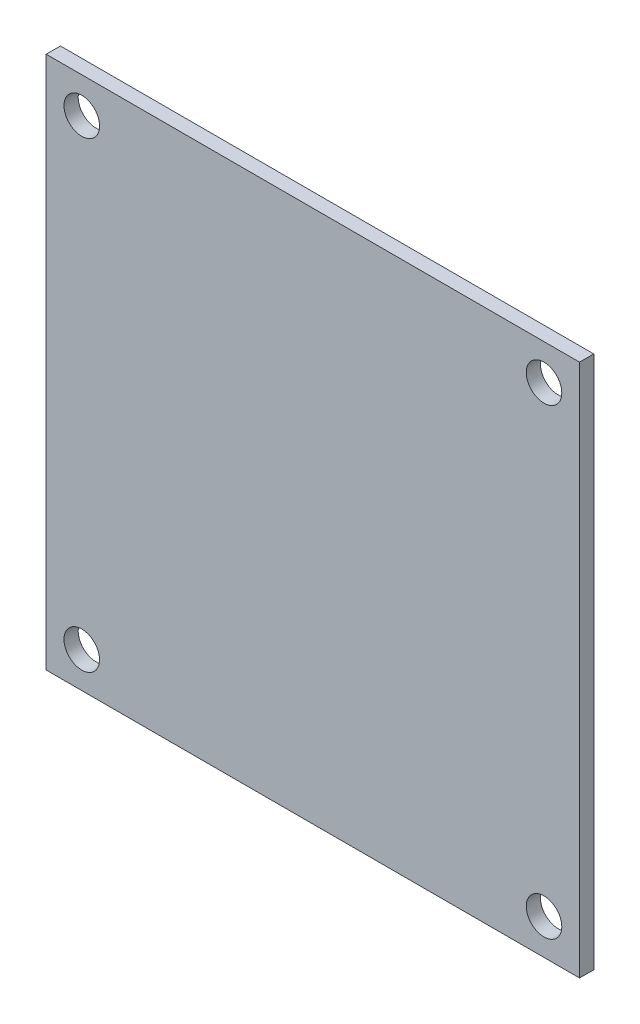
ISO-10303-21;
HEADER;
FILE_DESCRIPTION(('STEP AP214'),'2;1');
FILE_NAME('part.step','',(''),(''),'','','');
FILE_SCHEMA(('AUTOMOTIVE_DESIGN { 1 0 10303 214 1 1 1 1 }'));
ENDSEC;
DATA;
#1=APPLICATION_CONTEXT('core data for automotive mechanical design processes');
#2=APPLICATION_PROTOCOL_DEFINITION('international standard','automotive_design',2000,#1);
#3=PRODUCT_CONTEXT('',#1,'mechanical');
#4=PRODUCT('Part','Part','',(#3));
#5=PRODUCT_RELATED_PRODUCT_CATEGORY('part','',(#4));
#6=PRODUCT_DEFINITION_FORMATION('','',#4);
#7=PRODUCT_DEFINITION_CONTEXT('part definition',#1,'design');
#8=PRODUCT_DEFINITION('design','',#6,#7);
#9=PRODUCT_DEFINITION_SHAPE('','',#8);
#10=(LENGTH_UNIT() NAMED_UNIT(*) SI_UNIT(.MILLI.,.METRE.));
#11=(NAMED_UNIT(*) PLANE_ANGLE_UNIT() SI_UNIT($,.RADIAN.));
#12=(NAMED_UNIT(*) SI_UNIT($,.STERADIAN.) SOLID_ANGLE_UNIT());
#13=UNCERTAINTY_MEASURE_WITH_UNIT(LENGTH_MEASURE(1.E-05),#10,'distance_accuracy_value','');
#14=(GEOMETRIC_REPRESENTATION_CONTEXT(3) GLOBAL_UNCERTAINTY_ASSIGNED_CONTEXT((#13)) GLOBAL_UNIT_ASSIGNED_CONTEXT((#10,
#11,#12)) REPRESENTATION_CONTEXT('',''));
#15=CARTESIAN_POINT('',(0.,0.,0.));
#16=DIRECTION('',(0.,0.,1.));
#17=DIRECTION('',(1.,0.,0.));
#18=AXIS2_PLACEMENT_3D('',#15,#16,#17);
#19=CARTESIAN_POINT('',(-35.6563781725888,38.1752115059222,2.));
#20=DIRECTION('',(1.,0.,0.));
#21=DIRECTION('',(0.,1.,0.));
#22=AXIS2_PLACEMENT_3D('',#19,#20,#21);
#23=PLANE('',#22);
#24=DIRECTION('',(0.,-1.,0.));
#25=VECTOR('',#24,1.);
#26=CARTESIAN_POINT('',(-35.6563781725888,38.1752115059222,0.));
#27=LINE('',#26,#25);
#28=CARTESIAN_POINT('',(-35.6563781725888,38.1752115059222,0.));
#29=VERTEX_POINT('',#28);
#30=CARTESIAN_POINT('',(-35.6563781725888,-36.8247884940778,0.));
#31=VERTEX_POINT('',#30);
#32=EDGE_CURVE('E99',#29,#31,#27,.T.);
#33=ORIENTED_EDGE('',*,*,#32,.T.);
#34=DIRECTION('',(0.,0.,-1.));
#35=VECTOR('',#34,1.);
#36=CARTESIAN_POINT('',(-35.6563781725888,-36.8247884940778,2.));
#37=LINE('',#36,#35);
#38=CARTESIAN_POINT('',(-35.6563781725888,-36.8247884940778,2.));
#39=VERTEX_POINT('',#38);
#40=EDGE_CURVE('E11',#39,#31,#37,.T.);
#41=ORIENTED_EDGE('',*,*,#40,.F.);
#42=DIRECTION('',(0.,-1.,0.));
#43=VECTOR('',#42,1.);
#44=CARTESIAN_POINT('',(-35.6563781725888,38.1752115059222,2.));
#45=LINE('',#44,#43);
#46=CARTESIAN_POINT('',(-35.6563781725888,38.1752115059222,2.));
#47=VERTEX_POINT('',#46);
#48=EDGE_CURVE('E86',#47,#39,#45,.T.);
#49=ORIENTED_EDGE('',*,*,#48,.F.);
#50=DIRECTION('',(0.,0.,-1.));
#51=VECTOR('',#50,1.);
#52=CARTESIAN_POINT('',(-35.6563781725888,38.1752115059222,2.));
#53=LINE('',#52,#51);
#54=EDGE_CURVE('E95',#47,#29,#53,.T.);
#55=ORIENTED_EDGE('',*,*,#54,.T.);
#56=EDGE_LOOP('',(#33,#41,#49,#55));
#57=FACE_BOUND('',#56,.T.);
#58=ADVANCED_FACE('F33',(#57),#23,.F.);
#59=CARTESIAN_POINT('',(-35.6563781725888,-36.8247884940778,2.));
#60=DIRECTION('',(0.,1.,0.));
#61=DIRECTION('',(0.,0.,1.));
#62=AXIS2_PLACEMENT_3D('',#59,#60,#61);
#63=PLANE('',#62);
#64=DIRECTION('',(1.,0.,0.));
#65=VECTOR('',#64,1.);
#66=CARTESIAN_POINT('',(-35.6563781725888,-36.8247884940778,0.));
#67=LINE('',#66,#65);
#68=CARTESIAN_POINT('',(39.3436218274112,-36.8247884940778,0.));
#69=VERTEX_POINT('',#68);
#70=EDGE_CURVE('E90',#31,#69,#67,.T.);
#71=ORIENTED_EDGE('',*,*,#70,.T.);
#72=DIRECTION('',(0.,0.,-1.));
#73=VECTOR('',#72,1.);
#74=CARTESIAN_POINT('',(39.3436218274112,-36.8247884940778,2.));
#75=LINE('',#74,#73);
#76=CARTESIAN_POINT('',(39.3436218274112,-36.8247884940778,2.));
#77=VERTEX_POINT('',#76);
#78=EDGE_CURVE('E42',#77,#69,#75,.T.);
#79=ORIENTED_EDGE('',*,*,#78,.F.);
#80=DIRECTION('',(1.,0.,0.));
#81=VECTOR('',#80,1.);
#82=CARTESIAN_POINT('',(-35.6563781725888,-36.8247884940778,2.));
#83=LINE('',#82,#81);
#84=EDGE_CURVE('E81',#39,#77,#83,.T.);
#85=ORIENTED_EDGE('',*,*,#84,.F.);
#86=ORIENTED_EDGE('',*,*,#40,.T.);
#87=EDGE_LOOP('',(#71,#79,#85,#86));
#88=FACE_BOUND('',#87,.T.);
#89=ADVANCED_FACE('F89',(#88),#63,.F.);
#90=CARTESIAN_POINT('',(39.3436218274112,38.1752115059222,2.));
#91=DIRECTION('',(-1.,0.,0.));
#92=DIRECTION('',(0.,-1.,0.));
#93=AXIS2_PLACEMENT_3D('',#90,#91,#92);
#94=PLANE('',#93);
#95=DIRECTION('',(0.,1.,0.));
#96=VECTOR('',#95,1.);
#97=CARTESIAN_POINT('',(39.3436218274112,38.1752115059222,0.));
#98=LINE('',#97,#96);
#99=CARTESIAN_POINT('',(39.3436218274112,38.1752115059222,0.));
#100=VERTEX_POINT('',#99);
#101=EDGE_CURVE('E68',#69,#100,#98,.T.);
#102=ORIENTED_EDGE('',*,*,#101,.T.);
#103=DIRECTION('',(0.,0.,-1.));
#104=VECTOR('',#103,1.);
#105=CARTESIAN_POINT('',(39.3436218274112,38.1752115059222,2.));
#106=LINE('',#105,#104);
#107=CARTESIAN_POINT('',(39.3436218274112,38.1752115059222,2.));
#108=VERTEX_POINT('',#107);
#109=EDGE_CURVE('E91',#108,#100,#106,.T.);
#110=ORIENTED_EDGE('',*,*,#109,.F.);
#111=DIRECTION('',(0.,1.,0.));
#112=VECTOR('',#111,1.);
#113=CARTESIAN_POINT('',(39.3436218274112,38.1752115059222,2.));
#114=LINE('',#113,#112);
#115=EDGE_CURVE('E84',#77,#108,#114,.T.);
#116=ORIENTED_EDGE('',*,*,#115,.F.);
#117=ORIENTED_EDGE('',*,*,#78,.T.);
#118=EDGE_LOOP('',(#102,#110,#116,#117));
#119=FACE_BOUND('',#118,.T.);
#120=ADVANCED_FACE('F93',(#119),#94,.F.);
#121=CARTESIAN_POINT('',(-35.6563781725888,38.1752115059222,2.));
#122=DIRECTION('',(0.,-1.,0.));
#123=DIRECTION('',(0.,0.,-1.));
#124=AXIS2_PLACEMENT_3D('',#121,#122,#123);
#125=PLANE('',#124);
#126=DIRECTION('',(-1.,0.,0.));
#127=VECTOR('',#126,1.);
#128=CARTESIAN_POINT('',(-35.6563781725888,38.1752115059222,0.));
#129=LINE('',#128,#127);
#130=EDGE_CURVE('E74',#100,#29,#129,.T.);
#131=ORIENTED_EDGE('',*,*,#130,.T.);
#132=ORIENTED_EDGE('',*,*,#54,.F.);
#133=DIRECTION('',(-1.,0.,0.));
#134=VECTOR('',#133,1.);
#135=CARTESIAN_POINT('',(-35.6563781725888,38.1752115059222,2.));
#136=LINE('',#135,#134);
#137=EDGE_CURVE('E51',#108,#47,#136,.T.);
#138=ORIENTED_EDGE('',*,*,#137,.F.);
#139=ORIENTED_EDGE('',*,*,#109,.T.);
#140=EDGE_LOOP('',(#131,#132,#138,#139));
#141=FACE_BOUND('',#140,.T.);
#142=ADVANCED_FACE('F137',(#141),#125,.F.);
#143=CARTESIAN_POINT('',(0.,0.,2.));
#144=DIRECTION('',(0.,0.,1.));
#145=DIRECTION('',(1.,0.,0.));
#146=AXIS2_PLACEMENT_3D('',#143,#144,#145);
#147=PLANE('',#146);
#148=CARTESIAN_POINT('',(34.3436218274112,-31.8247884940778,2.));
#149=DIRECTION('',(0.,0.,1.));
#150=DIRECTION('',(1.,0.,0.));
#151=AXIS2_PLACEMENT_3D('',#148,#149,#150);
#152=CIRCLE('',#151,2.5);
#153=CARTESIAN_POINT('',(36.8436218274112,-31.8247884940778,2.));
#154=VERTEX_POINT('',#153);
#155=EDGE_CURVE('E126',#154,#154,#152,.T.);
#156=ORIENTED_EDGE('',*,*,#155,.F.);
#157=EDGE_LOOP('',(#156));
#158=FACE_BOUND('',#157,.T.);
#159=CARTESIAN_POINT('',(34.3436218274112,33.1752115059222,2.));
#160=DIRECTION('',(0.,0.,1.));
#161=DIRECTION('',(1.,0.,0.));
#162=AXIS2_PLACEMENT_3D('',#159,#160,#161);
#163=CIRCLE('',#162,2.5);
#164=CARTESIAN_POINT('',(36.8436218274112,33.1752115059222,2.));
#165=VERTEX_POINT('',#164);
#166=EDGE_CURVE('E116',#165,#165,#163,.T.);
#167=ORIENTED_EDGE('',*,*,#166,.F.);
#168=EDGE_LOOP('',(#167));
#169=FACE_BOUND('',#168,.T.);
#170=CARTESIAN_POINT('',(-30.6563781725888,-31.8247884940778,2.));
#171=DIRECTION('',(0.,0.,1.));
#172=DIRECTION('',(1.,0.,0.));
#173=AXIS2_PLACEMENT_3D('',#170,#171,#172);
#174=CIRCLE('',#173,2.5);
#175=CARTESIAN_POINT('',(-28.1563781725888,-31.8247884940778,2.));
#176=VERTEX_POINT('',#175);
#177=EDGE_CURVE('E113',#176,#176,#174,.T.);
#178=ORIENTED_EDGE('',*,*,#177,.F.);
#179=EDGE_LOOP('',(#178));
#180=FACE_BOUND('',#179,.T.);
#181=CARTESIAN_POINT('',(-30.6563781725888,33.1752115059222,2.));
#182=DIRECTION('',(0.,0.,1.));
#183=DIRECTION('',(1.,0.,0.));
#184=AXIS2_PLACEMENT_3D('',#181,#182,#183);
#185=CIRCLE('',#184,2.5);
#186=CARTESIAN_POINT('',(-28.1563781725888,33.1752115059222,2.));
#187=VERTEX_POINT('',#186);
#188=EDGE_CURVE('E110',#187,#187,#185,.T.);
#189=ORIENTED_EDGE('',*,*,#188,.F.);
#190=EDGE_LOOP('',(#189));
#191=FACE_BOUND('',#190,.T.);
#192=ORIENTED_EDGE('',*,*,#48,.T.);
#193=ORIENTED_EDGE('',*,*,#84,.T.);
#194=ORIENTED_EDGE('',*,*,#115,.T.);
#195=ORIENTED_EDGE('',*,*,#137,.T.);
#196=EDGE_LOOP('',(#192,#193,#194,#195));
#197=FACE_BOUND('',#196,.T.);
#198=ADVANCED_FACE('F82',(#158,#169,#180,#191,#197),#147,.T.);
#199=CARTESIAN_POINT('',(0.,0.,0.));
#200=DIRECTION('',(0.,0.,1.));
#201=DIRECTION('',(1.,0.,0.));
#202=AXIS2_PLACEMENT_3D('',#199,#200,#201);
#203=PLANE('',#202);
#204=CARTESIAN_POINT('',(34.3436218274112,-31.8247884940778,0.));
#205=DIRECTION('',(0.,0.,1.));
#206=DIRECTION('',(1.,0.,0.));
#207=AXIS2_PLACEMENT_3D('',#204,#205,#206);
#208=CIRCLE('',#207,2.5);
#209=CARTESIAN_POINT('',(36.8436218274112,-31.8247884940778,0.));
#210=VERTEX_POINT('',#209);
#211=EDGE_CURVE('E36',#210,#210,#208,.T.);
#212=ORIENTED_EDGE('',*,*,#211,.T.);
#213=EDGE_LOOP('',(#212));
#214=FACE_BOUND('',#213,.T.);
#215=CARTESIAN_POINT('',(34.3436218274112,33.1752115059222,0.));
#216=DIRECTION('',(0.,0.,1.));
#217=DIRECTION('',(1.,0.,0.));
#218=AXIS2_PLACEMENT_3D('',#215,#216,#217);
#219=CIRCLE('',#218,2.5);
#220=CARTESIAN_POINT('',(36.8436218274112,33.1752115059222,0.));
#221=VERTEX_POINT('',#220);
#222=EDGE_CURVE('E114',#221,#221,#219,.T.);
#223=ORIENTED_EDGE('',*,*,#222,.T.);
#224=EDGE_LOOP('',(#223));
#225=FACE_BOUND('',#224,.T.);
#226=CARTESIAN_POINT('',(-30.6563781725888,-31.8247884940778,0.));
#227=DIRECTION('',(0.,0.,1.));
#228=DIRECTION('',(1.,0.,0.));
#229=AXIS2_PLACEMENT_3D('',#226,#227,#228);
#230=CIRCLE('',#229,2.5);
#231=CARTESIAN_POINT('',(-28.1563781725888,-31.8247884940778,0.));
#232=VERTEX_POINT('',#231);
#233=EDGE_CURVE('E111',#232,#232,#230,.T.);
#234=ORIENTED_EDGE('',*,*,#233,.T.);
#235=EDGE_LOOP('',(#234));
#236=FACE_BOUND('',#235,.T.);
#237=CARTESIAN_POINT('',(-30.6563781725888,33.1752115059222,0.));
#238=DIRECTION('',(0.,0.,1.));
#239=DIRECTION('',(1.,0.,0.));
#240=AXIS2_PLACEMENT_3D('',#237,#238,#239);
#241=CIRCLE('',#240,2.5);
#242=CARTESIAN_POINT('',(-28.1563781725888,33.1752115059222,0.));
#243=VERTEX_POINT('',#242);
#244=EDGE_CURVE('E102',#243,#243,#241,.T.);
#245=ORIENTED_EDGE('',*,*,#244,.T.);
#246=EDGE_LOOP('',(#245));
#247=FACE_BOUND('',#246,.T.);
#248=ORIENTED_EDGE('',*,*,#32,.F.);
#249=ORIENTED_EDGE('',*,*,#130,.F.);
#250=ORIENTED_EDGE('',*,*,#101,.F.);
#251=ORIENTED_EDGE('',*,*,#70,.F.);
#252=EDGE_LOOP('',(#248,#249,#250,#251));
#253=FACE_BOUND('',#252,.T.);
#254=ADVANCED_FACE('F136',(#214,#225,#236,#247,#253),#203,.F.);
#255=CARTESIAN_POINT('',(-30.6563781725888,33.1752115059222,-8.));
#256=DIRECTION('',(0.,0.,1.));
#257=DIRECTION('',(1.,0.,0.));
#258=AXIS2_PLACEMENT_3D('',#255,#256,#257);
#259=CYLINDRICAL_SURFACE('',#258,2.5);
#260=ORIENTED_EDGE('',*,*,#188,.T.);
#261=EDGE_LOOP('',(#260));
#262=FACE_BOUND('',#261,.T.);
#263=ORIENTED_EDGE('',*,*,#244,.F.);
#264=EDGE_LOOP('',(#263));
#265=FACE_BOUND('',#264,.T.);
#266=ADVANCED_FACE('F132',(#262,#265),#259,.F.);
#267=CARTESIAN_POINT('',(-30.6563781725888,-31.8247884940778,-8.));
#268=DIRECTION('',(0.,0.,1.));
#269=DIRECTION('',(1.,0.,0.));
#270=AXIS2_PLACEMENT_3D('',#267,#268,#269);
#271=CYLINDRICAL_SURFACE('',#270,2.5);
#272=ORIENTED_EDGE('',*,*,#177,.T.);
#273=EDGE_LOOP('',(#272));
#274=FACE_BOUND('',#273,.T.);
#275=ORIENTED_EDGE('',*,*,#233,.F.);
#276=EDGE_LOOP('',(#275));
#277=FACE_BOUND('',#276,.T.);
#278=ADVANCED_FACE('F186',(#274,#277),#271,.F.);
#279=CARTESIAN_POINT('',(34.3436218274112,33.1752115059222,-8.));
#280=DIRECTION('',(0.,0.,1.));
#281=DIRECTION('',(1.,0.,0.));
#282=AXIS2_PLACEMENT_3D('',#279,#280,#281);
#283=CYLINDRICAL_SURFACE('',#282,2.5);
#284=ORIENTED_EDGE('',*,*,#166,.T.);
#285=EDGE_LOOP('',(#284));
#286=FACE_BOUND('',#285,.T.);
#287=ORIENTED_EDGE('',*,*,#222,.F.);
#288=EDGE_LOOP('',(#287));
#289=FACE_BOUND('',#288,.T.);
#290=ADVANCED_FACE('F194',(#286,#289),#283,.F.);
#291=CARTESIAN_POINT('',(34.3436218274112,-31.8247884940778,-8.));
#292=DIRECTION('',(0.,0.,1.));
#293=DIRECTION('',(1.,0.,0.));
#294=AXIS2_PLACEMENT_3D('',#291,#292,#293);
#295=CYLINDRICAL_SURFACE('',#294,2.5);
#296=ORIENTED_EDGE('',*,*,#155,.T.);
#297=EDGE_LOOP('',(#296));
#298=FACE_BOUND('',#297,.T.);
#299=ORIENTED_EDGE('',*,*,#211,.F.);
#300=EDGE_LOOP('',(#299));
#301=FACE_BOUND('',#300,.T.);
#302=ADVANCED_FACE('F204',(#298,#301),#295,.F.);
#303=CLOSED_SHELL('',(#58,#89,#120,#142,#198,#254,#266,#278,#290,#302));
#304=MANIFOLD_SOLID_BREP('B2',#303);
#305=ADVANCED_BREP_SHAPE_REPRESENTATION('',(#18,#304),#14);
#306=SHAPE_DEFINITION_REPRESENTATION(#9,#305);
ENDSEC;
END-ISO-10303-21;
